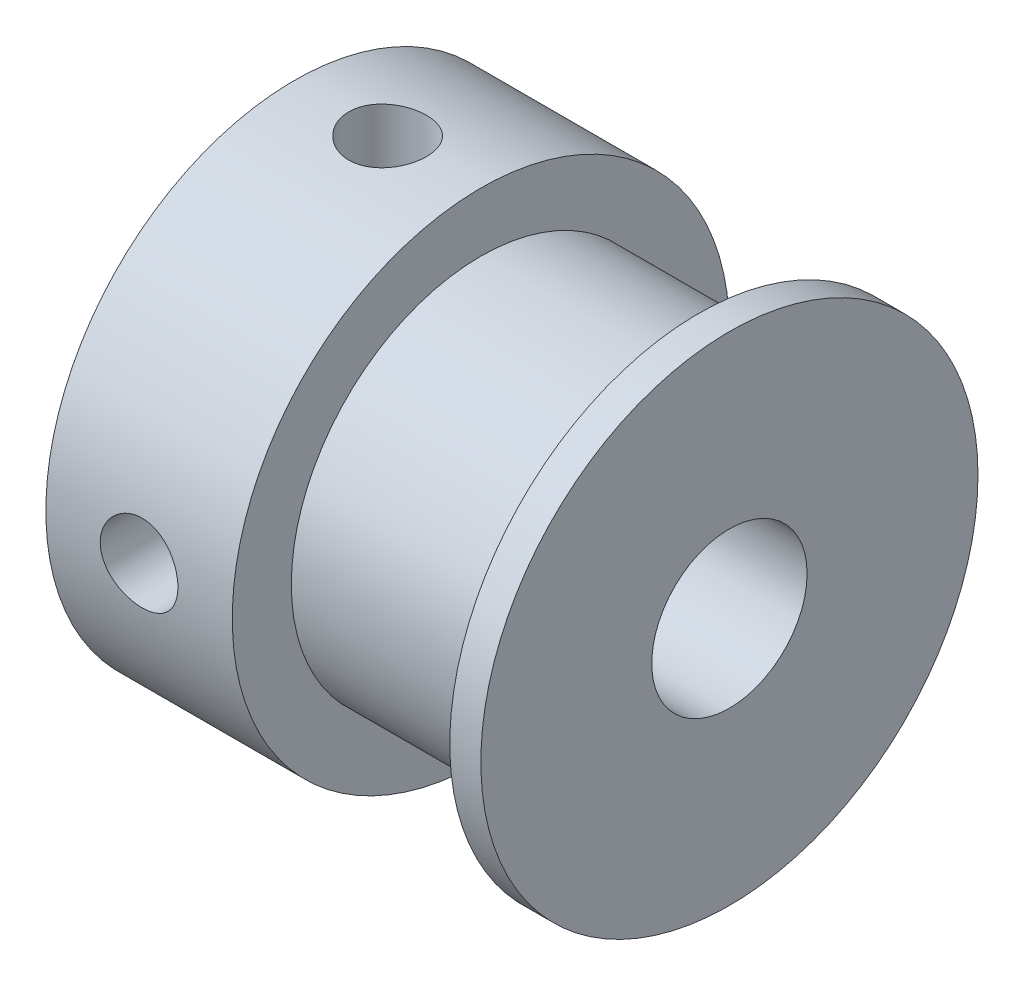
ISO-10303-21;
HEADER;
FILE_DESCRIPTION(('STEP AP214'),'2;1');
FILE_NAME('part.step','',(''),(''),'','','');
FILE_SCHEMA(('AUTOMOTIVE_DESIGN { 1 0 10303 214 1 1 1 1 }'));
ENDSEC;
DATA;
#1=APPLICATION_CONTEXT('core data for automotive mechanical design processes');
#2=APPLICATION_PROTOCOL_DEFINITION('international standard','automotive_design',2000,#1);
#3=PRODUCT_CONTEXT('',#1,'mechanical');
#4=PRODUCT('Part','Part','',(#3));
#5=PRODUCT_RELATED_PRODUCT_CATEGORY('part','',(#4));
#6=PRODUCT_DEFINITION_FORMATION('','',#4);
#7=PRODUCT_DEFINITION_CONTEXT('part definition',#1,'design');
#8=PRODUCT_DEFINITION('design','',#6,#7);
#9=PRODUCT_DEFINITION_SHAPE('','',#8);
#10=(LENGTH_UNIT() NAMED_UNIT(*) SI_UNIT(.MILLI.,.METRE.));
#11=(NAMED_UNIT(*) PLANE_ANGLE_UNIT() SI_UNIT($,.RADIAN.));
#12=(NAMED_UNIT(*) SI_UNIT($,.STERADIAN.) SOLID_ANGLE_UNIT());
#13=UNCERTAINTY_MEASURE_WITH_UNIT(LENGTH_MEASURE(1.E-05),#10,'distance_accuracy_value','');
#14=(GEOMETRIC_REPRESENTATION_CONTEXT(3) GLOBAL_UNCERTAINTY_ASSIGNED_CONTEXT((#13)) GLOBAL_UNIT_ASSIGNED_CONTEXT((#10,
#11,#12)) REPRESENTATION_CONTEXT('',''));
#15=CARTESIAN_POINT('',(0.,0.,0.));
#16=DIRECTION('',(0.,0.,1.));
#17=DIRECTION('',(1.,0.,0.));
#18=AXIS2_PLACEMENT_3D('',#15,#16,#17);
#19=CARTESIAN_POINT('',(0.,0.,0.));
#20=DIRECTION('',(1.,0.,0.));
#21=DIRECTION('',(0.,0.,-1.));
#22=AXIS2_PLACEMENT_3D('',#19,#20,#21);
#23=CYLINDRICAL_SURFACE('',#22,2.5);
#24=CARTESIAN_POINT('',(1.75000000000001,0.,2.5));
#25=CARTESIAN_POINT('',(1.75000412789938,0.0657149536912327,2.49999641755189));
#26=CARTESIAN_POINT('',(1.7552125914021,0.13150824962254,2.49738113774397));
#27=CARTESIAN_POINT('',(1.77581610042615,0.26115029408553,2.48717695046745));
#28=CARTESIAN_POINT('',(1.79123049124707,0.324995108391878,2.4795785978623));
#29=CARTESIAN_POINT('',(1.831492260771,0.448666931100716,2.4602034925414));
#30=CARTESIAN_POINT('',(1.85630298031002,0.508508503673972,2.448442989719));
#31=CARTESIAN_POINT('',(1.91446327670618,0.623090771008203,2.42182220644723));
#32=CARTESIAN_POINT('',(1.94781218031107,0.677831867487559,2.40696217041913));
#33=CARTESIAN_POINT('',(2.02439656185663,0.784384772202394,2.37445322822571));
#34=CARTESIAN_POINT('',(2.06810809904956,0.835819013902635,2.3566899890942));
#35=CARTESIAN_POINT('',(2.1631518490588,0.930974306083716,2.32074962808431));
#36=CARTESIAN_POINT('',(2.21448981471555,0.974689478883452,2.30257220261294));
#37=CARTESIAN_POINT('',(2.32810418690423,1.05656500056284,2.26623688996684));
#38=CARTESIAN_POINT('',(2.39092012293239,1.09403166943954,2.24818983712665));
#39=CARTESIAN_POINT('',(2.52295916998277,1.15771028361336,2.21607473465401));
#40=CARTESIAN_POINT('',(2.59217766090344,1.18393026870791,2.20200384508737));
#41=CARTESIAN_POINT('',(2.73083138177741,1.22266555273573,2.18072333797261));
#42=CARTESIAN_POINT('',(2.80000556508424,1.23590732135054,2.17315339479642));
#43=CARTESIAN_POINT('',(2.93997354722435,1.25053374163605,2.1647736243566));
#44=CARTESIAN_POINT('',(3.01076567608894,1.25193011046634,2.16395711679111));
#45=CARTESIAN_POINT('',(3.14285753039421,1.24335910896536,2.16888662821561));
#46=CARTESIAN_POINT('',(3.20428003902881,1.23473069942102,2.17385954577517));
#47=CARTESIAN_POINT('',(3.3246523867163,1.20867481132116,2.18845285917313));
#48=CARTESIAN_POINT('',(3.38360143163164,1.19124452987206,2.19807473539721));
#49=CARTESIAN_POINT('',(3.49903641570707,1.1477622254825,2.22109345515927));
#50=CARTESIAN_POINT('',(3.55543299848223,1.12151883389499,2.23457300829999));
#51=CARTESIAN_POINT('',(3.66329286573751,1.061302109585,2.26379255351755));
#52=CARTESIAN_POINT('',(3.71475391950011,1.02732530476558,2.27953355975239));
#53=CARTESIAN_POINT('',(3.81815156592903,0.94758256864098,2.31391447379108));
#54=CARTESIAN_POINT('',(3.86932109197019,0.900868072961596,2.33266887795933));
#55=CARTESIAN_POINT('',(3.96341927323862,0.799444473426712,2.36934529125509));
#56=CARTESIAN_POINT('',(4.00634399004235,0.744731570717852,2.38726689948501));
#57=CARTESIAN_POINT('',(4.08460707628715,0.625645632289807,2.42127484103705));
#58=CARTESIAN_POINT('',(4.11950059055717,0.560941989499257,2.43723730202509));
#59=CARTESIAN_POINT('',(4.17762128630375,0.425582769360993,2.46447351401553));
#60=CARTESIAN_POINT('',(4.20085773126895,0.354931970331593,2.47575098679441));
#61=CARTESIAN_POINT('',(4.23309425464584,0.215958114575875,2.49155417176795));
#62=CARTESIAN_POINT('',(4.24311404468347,0.147926913185404,2.4965617287664));
#63=CARTESIAN_POINT('',(4.2518309139181,0.0109744999366913,2.50091266823877));
#64=CARTESIAN_POINT('',(4.25053335704934,-0.057946274837377,2.5002587340164));
#65=CARTESIAN_POINT('',(4.23724163947655,-0.189041214982492,2.49363990316801));
#66=CARTESIAN_POINT('',(4.22608433408745,-0.251324260062442,2.48809057110237));
#67=CARTESIAN_POINT('',(4.19470241013114,-0.373008615377395,2.47277714143524));
#68=CARTESIAN_POINT('',(4.1744767919333,-0.432409607113745,2.46301257917916));
#69=CARTESIAN_POINT('',(4.12500191695853,-0.548610760562079,2.43980314267087));
#70=CARTESIAN_POINT('',(4.09551118735398,-0.605287996257689,2.42626102212424));
#71=CARTESIAN_POINT('',(4.02861558044244,-0.713076702123648,2.39679967896386));
#72=CARTESIAN_POINT('',(3.9912073317582,-0.764185787219099,2.38087944457232));
#73=CARTESIAN_POINT('',(3.9052994683339,-0.864709611613313,2.34635276671831));
#74=CARTESIAN_POINT('',(3.85607141443304,-0.913465097280795,2.32763606060552));
#75=CARTESIAN_POINT('',(3.75009356091336,-1.00232040139154,2.29077989504843));
#76=CARTESIAN_POINT('',(3.69333860147953,-1.04241423211355,2.27264084226908));
#77=CARTESIAN_POINT('',(3.57044543224961,-1.11463489312211,2.23813990282585));
#78=CARTESIAN_POINT('',(3.50398591723925,-1.14628186984829,2.2219066207934));
#79=CARTESIAN_POINT('',(3.36561241538434,-1.19760353251725,2.19467590460158));
#80=CARTESIAN_POINT('',(3.29370559187351,-1.21729364485946,2.18367172800773));
#81=CARTESIAN_POINT('',(3.15386222142319,-1.24232710931209,2.16951876260834));
#82=CARTESIAN_POINT('',(3.0862071832137,-1.24886624550107,2.16571729325614));
#83=CARTESIAN_POINT('',(2.95069116603659,-1.25086144297598,2.16456693307719));
#84=CARTESIAN_POINT('',(2.88283028907571,-1.24632230828049,2.16721524534441));
#85=CARTESIAN_POINT('',(2.75564562308498,-1.22740765699032,2.17797327562531));
#86=CARTESIAN_POINT('',(2.6961244123195,-1.21401039292849,2.18553868102992));
#87=CARTESIAN_POINT('',(2.58023985071912,-1.1789691977808,2.20463770234897));
#88=CARTESIAN_POINT('',(2.52387752238504,-1.15732261394975,2.21617259462095));
#89=CARTESIAN_POINT('',(2.41171893626674,-1.10476968162585,2.2428566295566));
#90=CARTESIAN_POINT('',(2.35621512271288,-1.07333892227057,2.25819652995239));
#91=CARTESIAN_POINT('',(2.25090682977427,-1.00268871454579,2.29044164543238));
#92=CARTESIAN_POINT('',(2.20110533685189,-0.963465214048303,2.30734767243153));
#93=CARTESIAN_POINT('',(2.10232252205298,-0.872754158330795,2.34327903949142));
#94=CARTESIAN_POINT('',(2.0541761220476,-0.820355528762707,2.36231229139336));
#95=CARTESIAN_POINT('',(1.96717127072046,-0.707693507775343,2.3984719031886));
#96=CARTESIAN_POINT('',(1.92831782571714,-0.647425904070975,2.4155972326005));
#97=CARTESIAN_POINT('',(1.86095454654725,-0.519914496024928,2.44622511981379));
#98=CARTESIAN_POINT('',(1.83251978823571,-0.452624379918263,2.45970120703636));
#99=CARTESIAN_POINT('',(1.78773979010132,-0.313427626617735,2.48126676704332));
#100=CARTESIAN_POINT('',(1.77136019146303,-0.241534749528953,2.48937154216165));
#101=CARTESIAN_POINT('',(1.7576282361552,-0.140752433104227,2.49619327387079));
#102=CARTESIAN_POINT('',(1.75477169892048,-0.112702349299371,2.49761706674002));
#103=CARTESIAN_POINT('',(1.750956668104,-0.0564396647589458,2.49952121222331));
#104=CARTESIAN_POINT('',(1.74999822691101,-0.0282270595592261,2.50000153879704));
#105=CARTESIAN_POINT('',(1.75000000000001,0.,2.5));
#106=B_SPLINE_CURVE_WITH_KNOTS('',3,(#24,#25,#26,#27,#28,#29,#30,#31,#32,#33,#34,#35,#36,#37,
#38,#39,#40,#41,#42,#43,#44,#45,#46,#47,#48,#49,#50,#51,#52,#53,#54,#55,#56,#57,#58,#59,#60,#61,
#62,#63,#64,#65,#66,#67,#68,#69,#70,#71,#72,#73,#74,#75,#76,#77,#78,#79,#80,#81,#82,#83,#84,#85,
#86,#87,#88,#89,#90,#91,#92,#93,#94,#95,#96,#97,#98,#99,#100,#101,#102,#103,#104,#105),
.UNSPECIFIED.,.T.,.F.,(4,2,2,2,2,2,2,2,2,2,2,2,2,2,2,2,2,2,2,2,2,2,2,2,2,2,2,2,2,2,2,2,2,2,2,2,
2,2,2,2,4),(0.,0.197030321775364,0.394435187136495,0.59107769436537,0.787704700726955,
0.996227198397605,1.20490779706754,1.4297715803844,1.6544743487285,1.86572515175286,
2.07676696661274,2.26257140511649,2.44843504907097,2.63862800210608,2.82890651575276,
3.04331176667346,3.25781918248356,3.48228777768049,3.70657771140347,3.9122911308918,
4.11790705639343,4.3075863313265,4.49728652038662,4.69241070034871,4.88761813435421,
5.10199513305521,5.31651985769287,5.54143352699589,5.76605639925969,5.96911634372963,
6.17208824825003,6.35572412805225,6.53941910979594,6.73545570969514,6.93159451423693,
7.15156553440619,7.37165479220712,7.59330017078652,7.81431135781158,7.89894100172117,
7.98357298143554),.UNSPECIFIED.);
#107=CARTESIAN_POINT('',(1.75000000000001,0.,2.5));
#108=VERTEX_POINT('',#107);
#109=EDGE_CURVE('E90',#108,#108,#106,.T.);
#110=ORIENTED_EDGE('',*,*,#109,.F.);
#111=EDGE_LOOP('',(#110));
#112=FACE_BOUND('',#111,.T.);
#113=CARTESIAN_POINT('',(3.,2.1650635094611,-1.25));
#114=CARTESIAN_POINT('',(3.06513476024406,2.16506918410574,-1.24999545384316));
#115=CARTESIAN_POINT('',(3.13035176440631,2.16804751484696,-1.24487496341652));
#116=CARTESIAN_POINT('',(3.25878408084644,2.17952958065066,-1.22465401237257));
#117=CARTESIAN_POINT('',(3.32199489380426,2.18804492569449,-1.20953258069272));
#118=CARTESIAN_POINT('',(3.44431458042993,2.20936683256748,-1.17012493587476));
#119=CARTESIAN_POINT('',(3.50344331559198,2.22215054341565,-1.14588744061716));
#120=CARTESIAN_POINT('',(3.6167802524959,2.25053331021072,-1.08908440672046));
#121=CARTESIAN_POINT('',(3.67098818782807,2.26613251845081,-1.05651841754472));
#122=CARTESIAN_POINT('',(3.77788216069688,2.29996086321802,-0.980833175663598));
#123=CARTESIAN_POINT('',(3.83007391959193,2.31830079547442,-0.937065045179713));
#124=CARTESIAN_POINT('',(3.92676048550839,2.35464978482132,-0.841567259518085));
#125=CARTESIAN_POINT('',(3.9712514532294,2.37265867289062,-0.789833657227866));
#126=CARTESIAN_POINT('',(4.05420893893458,2.40776846191186,-0.675611954268182));
#127=CARTESIAN_POINT('',(4.09206720982441,2.42472633022716,-0.612633986265718));
#128=CARTESIAN_POINT('',(4.1564260665572,2.45438445124411,-0.48019628324938));
#129=CARTESIAN_POINT('',(4.18293382017146,2.46708738979677,-0.410740672672694));
#130=CARTESIAN_POINT('',(4.22188082662637,2.48600576555297,-0.272556179907471));
#131=CARTESIAN_POINT('',(4.23518690794442,2.49261850276115,-0.204127238111022));
#132=CARTESIAN_POINT('',(4.2502076483438,2.50009479807584,-0.0657132858723104));
#133=CARTESIAN_POINT('',(4.25192932099464,2.50096183480737,0.00427075730467264));
#134=CARTESIAN_POINT('',(4.24406665753706,2.49703727395563,0.137290655529687));
#135=CARTESIAN_POINT('',(4.23545248059847,2.49273119865201,0.200401498970989));
#136=CARTESIAN_POINT('',(4.20889894511918,2.47967806574684,0.324142214897902));
#137=CARTESIAN_POINT('',(4.19095888877972,2.47093067582992,0.384771901367406));
#138=CARTESIAN_POINT('',(4.14614679238773,2.44964479109568,0.502886739461942));
#139=CARTESIAN_POINT('',(4.11915460853491,2.43705551911499,0.560316779393972));
#140=CARTESIAN_POINT('',(4.05717072974813,2.40922057483359,0.66997100189166));
#141=CARTESIAN_POINT('',(4.02217617087206,2.39397395196855,0.722193311048307));
#142=CARTESIAN_POINT('',(3.94138081058373,2.36055492999037,0.825217076122743));
#143=CARTESIAN_POINT('',(3.89487121459249,2.34224219997719,0.8754175937867));
#144=CARTESIAN_POINT('',(3.79426284383728,2.30567925733515,0.967630462872225));
#145=CARTESIAN_POINT('',(3.74015828465742,2.28742910332036,1.00963651446779));
#146=CARTESIAN_POINT('',(3.62168975946989,2.25180195115606,1.08688166830276));
#147=CARTESIAN_POINT('',(3.55689247118223,2.23455399988385,1.12152164372256));
#148=CARTESIAN_POINT('',(3.42132791080125,2.2046931284822,1.17914889125154));
#149=CARTESIAN_POINT('',(3.35056695872805,2.19207537557584,1.20214832276361));
#150=CARTESIAN_POINT('',(3.21098186089651,2.17430794771293,1.2339752637813));
#151=CARTESIAN_POINT('',(3.14244860119556,2.16864569810621,1.24378140264997));
#152=CARTESIAN_POINT('',(3.00449832310432,2.16397399202012,1.25189618326428));
#153=CARTESIAN_POINT('',(2.93508196360027,2.1649598361164,1.25021294664378));
#154=CARTESIAN_POINT('',(2.80543260177659,2.17292920675731,1.23629505417996));
#155=CARTESIAN_POINT('',(2.74502568611509,2.17924484383318,1.22523477089058));
#156=CARTESIAN_POINT('',(2.6270402671613,2.19617526939176,1.19462035579055));
#157=CARTESIAN_POINT('',(2.56946268656674,2.20679145006292,1.17506347327952));
#158=CARTESIAN_POINT('',(2.45573583637163,2.23170277599571,1.12705948575611));
#159=CARTESIAN_POINT('',(2.39977622893306,2.24614554053829,1.0982425796159));
#160=CARTESIAN_POINT('',(2.29316341057626,2.27695149371562,1.03285883001975));
#161=CARTESIAN_POINT('',(2.2425129456084,2.29331566693935,0.99628800541527));
#162=CARTESIAN_POINT('',(2.14127654059557,2.3285999807042,0.911046458998566));
#163=CARTESIAN_POINT('',(2.09150356160293,2.34758228942861,0.861431590393708));
#164=CARTESIAN_POINT('',(2.00073470250801,2.38417793722366,0.75425561924786));
#165=CARTESIAN_POINT('',(1.95974178721183,2.40179081259637,0.696691843319183));
#166=CARTESIAN_POINT('',(1.88678284256237,2.43426702113696,0.573169203198446));
#167=CARTESIAN_POINT('',(1.85508360223636,2.44904552090037,0.507028871967641));
#168=CARTESIAN_POINT('',(1.80357762017826,2.47354193699126,0.369402955801352));
#169=CARTESIAN_POINT('',(1.78376043579212,2.48326429595466,0.29792212674022));
#170=CARTESIAN_POINT('',(1.75828929478167,2.49584385227353,0.158724602913021));
#171=CARTESIAN_POINT('',(1.75150265515486,2.49924909885239,0.0912643048130715));
#172=CARTESIAN_POINT('',(1.748945918182,2.50052662968914,-0.0439074824390041));
#173=CARTESIAN_POINT('',(1.75317196434555,2.49840085083612,-0.111618875368858));
#174=CARTESIAN_POINT('',(1.77177050849453,2.48917461047403,-0.240672490396433));
#175=CARTESIAN_POINT('',(1.78545606157209,2.48241118334987,-0.302140397264079));
#176=CARTESIAN_POINT('',(1.82165874912871,2.46490117079279,-0.421807440229521));
#177=CARTESIAN_POINT('',(1.84417715011682,2.45415401415995,-0.480006106194385));
#178=CARTESIAN_POINT('',(1.89840881520747,2.4290741343515,-0.594279257806105));
#179=CARTESIAN_POINT('',(1.9304741540098,2.41460771498499,-0.650156428375057));
#180=CARTESIAN_POINT('',(2.00244741357381,2.38360166427283,-0.75596830226753));
#181=CARTESIAN_POINT('',(2.04235893639459,2.36706108197951,-0.805900259268633));
#182=CARTESIAN_POINT('',(2.13349642377838,2.33160762783285,-0.903642505196113));
#183=CARTESIAN_POINT('',(2.18545310934649,2.31262248764622,-0.950747105674089));
#184=CARTESIAN_POINT('',(2.29681340141221,2.27578845203566,-1.03582910924334));
#185=CARTESIAN_POINT('',(2.35622352608461,2.25794057202332,-1.07379843751257));
#186=CARTESIAN_POINT('',(2.48329580822619,2.22499506631145,-1.14053884973207));
#187=CARTESIAN_POINT('',(2.55115941391092,2.21000217820338,-1.16898133245117));
#188=CARTESIAN_POINT('',(2.69166550542472,2.1858269541044,-1.21359838688301));
#189=CARTESIAN_POINT('',(2.76429111114086,2.17662520184628,-1.22981398896918));
#190=CARTESIAN_POINT('',(2.864756694565,2.16911590752238,-1.24295875983052));
#191=CARTESIAN_POINT('',(2.89170986799735,2.1676016125644,-1.24559513120481));
#192=CARTESIAN_POINT('',(2.9457706008528,2.16557419859688,-1.24911675636245));
#193=CARTESIAN_POINT('',(2.97287817048234,2.16506114656387,-1.25000189299984));
#194=CARTESIAN_POINT('',(3.,2.1650635094611,-1.25));
#195=B_SPLINE_CURVE_WITH_KNOTS('',3,(#113,#114,#115,#116,#117,#118,#119,#120,#121,#122,#123,
#124,#125,#126,#127,#128,#129,#130,#131,#132,#133,#134,#135,#136,#137,#138,#139,#140,#141,#142,
#143,#144,#145,#146,#147,#148,#149,#150,#151,#152,#153,#154,#155,#156,#157,#158,#159,#160,#161,
#162,#163,#164,#165,#166,#167,#168,#169,#170,#171,#172,#173,#174,#175,#176,#177,#178,#179,#180,
#181,#182,#183,#184,#185,#186,#187,#188,#189,#190,#191,#192,#193,#194),.UNSPECIFIED.,.T.,.F.,(4,
2,2,2,2,2,2,2,2,2,2,2,2,2,2,2,2,2,2,2,2,2,2,2,2,2,2,2,2,2,2,2,2,2,2,2,2,2,2,2,4),(0.,
0.195290153243394,0.390991116031005,0.585660744898606,0.780340906806436,0.99107789062279,
1.20191963855464,1.42697365298454,1.65188533704864,1.86079356209919,2.0695752960755,
2.26020121855673,2.45084140646819,2.64411918413933,2.8374662418784,3.04908989321113,
3.26087560307398,3.4861105216181,3.71110967764631,3.91827863567764,4.12530116485466,
4.30967729280032,4.49411315545078,4.68709120507609,4.88016857775059,5.09758429475766,
5.31507331222752,5.53830226766207,5.76133474760964,5.96390337986858,6.16640108492464,
6.35555531089365,6.54473666890016,6.74200938399339,6.93937287625898,7.15637802312584,
7.37357428556442,7.59763436298256,7.8209391625345,7.90225168981636,7.98356965618175),.UNSPECIFIED.);
#196=CARTESIAN_POINT('',(3.,2.1650635094611,-1.25));
#197=VERTEX_POINT('',#196);
#198=EDGE_CURVE('E81',#197,#197,#195,.T.);
#199=ORIENTED_EDGE('',*,*,#198,.F.);
#200=EDGE_LOOP('',(#199));
#201=FACE_BOUND('',#200,.T.);
#202=CARTESIAN_POINT('',(14.,0.,0.));
#203=DIRECTION('',(1.,0.,0.));
#204=DIRECTION('',(0.,0.,-1.));
#205=AXIS2_PLACEMENT_3D('',#202,#203,#204);
#206=CIRCLE('',#205,2.5);
#207=CARTESIAN_POINT('',(14.,0.,-2.5));
#208=VERTEX_POINT('',#207);
#209=EDGE_CURVE('E89',#208,#208,#206,.T.);
#210=ORIENTED_EDGE('',*,*,#209,.T.);
#211=EDGE_LOOP('',(#210));
#212=FACE_BOUND('',#211,.T.);
#213=CARTESIAN_POINT('',(0.,0.,0.));
#214=DIRECTION('',(1.,0.,0.));
#215=DIRECTION('',(0.,0.,-1.));
#216=AXIS2_PLACEMENT_3D('',#213,#214,#215);
#217=CIRCLE('',#216,2.5);
#218=CARTESIAN_POINT('',(0.,0.,-2.5));
#219=VERTEX_POINT('',#218);
#220=EDGE_CURVE('E55',#219,#219,#217,.T.);
#221=ORIENTED_EDGE('',*,*,#220,.F.);
#222=EDGE_LOOP('',(#221));
#223=FACE_BOUND('',#222,.T.);
#224=ADVANCED_FACE('F37',(#112,#201,#212,#223),#23,.F.);
#225=CARTESIAN_POINT('',(0.,2.5,0.));
#226=DIRECTION('',(-1.,0.,0.));
#227=DIRECTION('',(0.,0.,1.));
#228=AXIS2_PLACEMENT_3D('',#225,#226,#227);
#229=PLANE('',#228);
#230=ORIENTED_EDGE('',*,*,#220,.T.);
#231=EDGE_LOOP('',(#230));
#232=FACE_BOUND('',#231,.T.);
#233=CARTESIAN_POINT('',(0.,0.,0.));
#234=DIRECTION('',(1.,0.,0.));
#235=DIRECTION('',(0.,0.,-1.));
#236=AXIS2_PLACEMENT_3D('',#233,#234,#235);
#237=CIRCLE('',#236,8.);
#238=CARTESIAN_POINT('',(0.,0.,-8.));
#239=VERTEX_POINT('',#238);
#240=EDGE_CURVE('E60',#239,#239,#237,.T.);
#241=ORIENTED_EDGE('',*,*,#240,.F.);
#242=EDGE_LOOP('',(#241));
#243=FACE_BOUND('',#242,.T.);
#244=ADVANCED_FACE('F122',(#232,#243),#229,.T.);
#245=CARTESIAN_POINT('',(0.,0.,0.));
#246=DIRECTION('',(1.,0.,0.));
#247=DIRECTION('',(0.,0.,-1.));
#248=AXIS2_PLACEMENT_3D('',#245,#246,#247);
#249=CYLINDRICAL_SURFACE('',#248,8.);
#250=CARTESIAN_POINT('',(1.75000000000001,0.,8.));
#251=CARTESIAN_POINT('',(1.75000284913577,-0.069757548635516,7.99999885097242));
#252=CARTESIAN_POINT('',(1.75585905688679,-0.139554702432851,7.9990780624287));
#253=CARTESIAN_POINT('',(1.77912184563838,-0.277195657489049,7.99549349048796));
#254=CARTESIAN_POINT('',(1.79653944625176,-0.345037530661656,7.99282804422361));
#255=CARTESIAN_POINT('',(1.84238983140332,-0.476756269023699,7.98605348582888));
#256=CARTESIAN_POINT('',(1.87081404068081,-0.540636176144948,7.98194549781586));
#257=CARTESIAN_POINT('',(1.93784927257081,-0.662710625522296,7.97273897019077));
#258=CARTESIAN_POINT('',(1.97645897151798,-0.72090590518415,7.96764055931276));
#259=CARTESIAN_POINT('',(2.06311652417698,-0.830459955825804,7.95697134207178));
#260=CARTESIAN_POINT('',(2.11123349744513,-0.881763739571317,7.95139725696168));
#261=CARTESIAN_POINT('',(2.21539097413445,-0.975603844114111,7.94043038065143));
#262=CARTESIAN_POINT('',(2.2714319486501,-1.01813964327095,7.93503760025374));
#263=CARTESIAN_POINT('',(2.39021913567187,-1.09345272164441,7.92501214063723));
#264=CARTESIAN_POINT('',(2.4529997411809,-1.12617636778995,7.92038369893052));
#265=CARTESIAN_POINT('',(2.58325070542891,-1.18059340798532,7.91245600871183));
#266=CARTESIAN_POINT('',(2.65072078625528,-1.20228745505031,7.90915668151108));
#267=CARTESIAN_POINT('',(2.78785545057189,-1.23385779661083,7.90429317255518));
#268=CARTESIAN_POINT('',(2.8574977929094,-1.24382852743747,7.90271513266182));
#269=CARTESIAN_POINT('',(2.99748359444632,-1.2519618487881,7.90143085535887));
#270=CARTESIAN_POINT('',(3.06782700973302,-1.25012517430232,7.90172450144012));
#271=CARTESIAN_POINT('',(3.20654851592634,-1.23477290404444,7.90413775227603));
#272=CARTESIAN_POINT('',(3.27493861167657,-1.22136281479846,7.90624086092473));
#273=CARTESIAN_POINT('',(3.40848600317966,-1.18340968916875,7.91201028172737));
#274=CARTESIAN_POINT('',(3.47364320032027,-1.15886631342065,7.91567664153206));
#275=CARTESIAN_POINT('',(3.59919435633857,-1.09923458474692,7.92417753427311));
#276=CARTESIAN_POINT('',(3.65956689588653,-1.06410186157774,7.92901696543622));
#277=CARTESIAN_POINT('',(3.77359976784276,-0.98432029073318,7.93931523075049));
#278=CARTESIAN_POINT('',(3.82725962244373,-0.939670766265077,7.94477410894106));
#279=CARTESIAN_POINT('',(3.92695512331665,-0.841545444111659,7.95576893124448));
#280=CARTESIAN_POINT('',(3.97290157913472,-0.78797900280269,7.96130506817796));
#281=CARTESIAN_POINT('',(4.05516657281994,-0.673848473689675,7.97177562673913));
#282=CARTESIAN_POINT('',(4.09148506177841,-0.613284350340655,7.97671004531012));
#283=CARTESIAN_POINT('',(4.15346903671119,-0.486797963528243,7.98542699513518));
#284=CARTESIAN_POINT('',(4.17912727926649,-0.420872093120228,7.98920874270967));
#285=CARTESIAN_POINT('',(4.21898298372361,-0.285574767348378,7.99518780000339));
#286=CARTESIAN_POINT('',(4.23318128703323,-0.216203565343599,7.99738522604488));
#287=CARTESIAN_POINT('',(4.24959463822509,-0.076754168381867,7.99993255863639));
#288=CARTESIAN_POINT('',(4.25193223948808,-0.00669073075435079,8.0003013589643));
#289=CARTESIAN_POINT('',(4.244883647332,0.13282727320582,7.99920143245634));
#290=CARTESIAN_POINT('',(4.23549784870544,0.202281859962577,7.99773276749821));
#291=CARTESIAN_POINT('',(4.2053708061599,0.33823672313285,7.99313461846611));
#292=CARTESIAN_POINT('',(4.18468962086613,0.404750631028019,7.99001392107693));
#293=CARTESIAN_POINT('',(4.1326224528006,0.53336703392831,7.98246037841779));
#294=CARTESIAN_POINT('',(4.10123593077866,0.5954693065197,7.97802746705036));
#295=CARTESIAN_POINT('',(4.02836400443671,0.7140361011252,7.96829486370472));
#296=CARTESIAN_POINT('',(3.98680128995476,0.770452561891857,7.9629886433171));
#297=CARTESIAN_POINT('',(3.8948639570461,0.875553482539025,7.95211940232218));
#298=CARTESIAN_POINT('',(3.84448878039757,0.924237452235083,7.94655636546338));
#299=CARTESIAN_POINT('',(3.73580940139139,1.01294040388345,7.93574013768325));
#300=CARTESIAN_POINT('',(3.67743757643883,1.05287699292062,7.93049020595401));
#301=CARTESIAN_POINT('',(3.55474196316933,1.1223778386332,7.92095346402914));
#302=CARTESIAN_POINT('',(3.49041834625526,1.15194239389052,7.91666662610999));
#303=CARTESIAN_POINT('',(3.3578851796429,1.19973385972497,7.90956535676178));
#304=CARTESIAN_POINT('',(3.28969126561719,1.21800327473955,7.9067454117448));
#305=CARTESIAN_POINT('',(3.15115542816801,1.24282061020267,7.90288285140397));
#306=CARTESIAN_POINT('',(3.0808136672905,1.24936941542498,7.9018401019222));
#307=CARTESIAN_POINT('',(2.94080064204626,1.25053726345377,7.90165529022442));
#308=CARTESIAN_POINT('',(2.87113045153325,1.24528590274212,7.90249258021451));
#309=CARTESIAN_POINT('',(2.73367735142786,1.2232811162795,7.90592849470915));
#310=CARTESIAN_POINT('',(2.66589443774914,1.2065277154348,7.90852711539976));
#311=CARTESIAN_POINT('',(2.53418108667974,1.16204164945925,7.91518544427453));
#312=CARTESIAN_POINT('',(2.4702472608708,1.1343188086929,7.91924384476704));
#313=CARTESIAN_POINT('',(2.34791719316187,1.06869384273208,7.92836592023698));
#314=CARTESIAN_POINT('',(2.28952117085579,1.03079131410442,7.93342963505413));
#315=CARTESIAN_POINT('',(2.17926722793659,0.945415040695392,7.9440578404613));
#316=CARTESIAN_POINT('',(2.12748390169309,0.897845535473836,7.94962700580145));
#317=CARTESIAN_POINT('',(2.03258938180664,0.794687973191015,7.96060021820367));
#318=CARTESIAN_POINT('',(1.98948020070407,0.739098060392157,7.96600422670061));
#319=CARTESIAN_POINT('',(1.91292438848422,0.621083429421703,7.9760755122835));
#320=CARTESIAN_POINT('',(1.8795373136202,0.558619686071187,7.98073817215134));
#321=CARTESIAN_POINT('',(1.82377950190353,0.428925941178889,7.9887562991944));
#322=CARTESIAN_POINT('',(1.80139751372081,0.361700888290878,7.9921131007106));
#323=CARTESIAN_POINT('',(1.77328348945471,0.245157119955795,7.9963872293244));
#324=CARTESIAN_POINT('',(1.76456575468551,0.196552787825811,7.99773495813061));
#325=CARTESIAN_POINT('',(1.75292304331047,0.0986388989252902,7.99954174348811));
#326=CARTESIAN_POINT('',(1.74999798522134,0.0493293520845589,8.00000081253982));
#327=CARTESIAN_POINT('',(1.75000000000001,0.,8.));
#328=B_SPLINE_CURVE_WITH_KNOTS('',3,(#250,#251,#252,#253,#254,#255,#256,#257,#258,#259,#260,
#261,#262,#263,#264,#265,#266,#267,#268,#269,#270,#271,#272,#273,#274,#275,#276,#277,#278,#279,
#280,#281,#282,#283,#284,#285,#286,#287,#288,#289,#290,#291,#292,#293,#294,#295,#296,#297,#298,
#299,#300,#301,#302,#303,#304,#305,#306,#307,#308,#309,#310,#311,#312,#313,#314,#315,#316,#317,
#318,#319,#320,#321,#322,#323,#324,#325,#326,#327),.UNSPECIFIED.,.T.,.F.,(4,2,2,2,2,2,2,2,2,2,2,
2,2,2,2,2,2,2,2,2,2,2,2,2,2,2,2,2,2,2,2,2,2,2,2,2,2,2,4),(0.,0.209092370238744,
0.418384321264004,0.62751353972051,0.836615593960145,1.04729784076099,1.2579926182271,
1.46981889302879,1.68163262504618,1.89172815567496,2.10181060835271,2.30999788011289,
2.51819149825524,2.72726988701172,2.93636314946032,3.14772866167182,3.35909524756912,
3.5706052187728,3.78209965914931,3.99140427002955,4.20070183264176,4.40889722378281,
4.61710310371013,4.82694270734833,5.03679560800705,5.24854740124793,5.46029309824487,
5.67123705197562,5.88216508114645,6.09078790799342,6.29941028309444,6.50784623483305,
6.7162904483567,6.92691006157766,7.13757848571146,7.34951152099917,7.56122742828136,
7.70909008175765,7.8569506552935),.UNSPECIFIED.);
#329=CARTESIAN_POINT('',(1.75000000000001,0.,8.));
#330=VERTEX_POINT('',#329);
#331=EDGE_CURVE('E10',#330,#330,#328,.T.);
#332=ORIENTED_EDGE('',*,*,#331,.F.);
#333=EDGE_LOOP('',(#332));
#334=FACE_BOUND('',#333,.T.);
#335=CARTESIAN_POINT('',(4.25,8.,0.));
#336=CARTESIAN_POINT('',(4.24999715086424,7.99999885097242,-0.0697575486355163));
#337=CARTESIAN_POINT('',(4.24414094311322,7.9990780624287,-0.139554702432852));
#338=CARTESIAN_POINT('',(4.22087815436162,7.99549349048796,-0.277195657489051));
#339=CARTESIAN_POINT('',(4.20346055374824,7.99282804422361,-0.345037530661658));
#340=CARTESIAN_POINT('',(4.15761016859669,7.98605348582888,-0.476756269023701));
#341=CARTESIAN_POINT('',(4.1291859593192,7.98194549781586,-0.540636176144951));
#342=CARTESIAN_POINT('',(4.0621507274292,7.97273897019077,-0.662710625522299));
#343=CARTESIAN_POINT('',(4.02354102848203,7.96764055931276,-0.720905905184153));
#344=CARTESIAN_POINT('',(3.93688347582302,7.95697134207178,-0.830459955825808));
#345=CARTESIAN_POINT('',(3.88876650255487,7.95139725696168,-0.881763739571321));
#346=CARTESIAN_POINT('',(3.78460902586555,7.94043038065143,-0.975603844114115));
#347=CARTESIAN_POINT('',(3.7285680513499,7.93503760025374,-1.01813964327096));
#348=CARTESIAN_POINT('',(3.60978086432814,7.92501214063723,-1.09345272164442));
#349=CARTESIAN_POINT('',(3.5470002588191,7.92038369893052,-1.12617636778996));
#350=CARTESIAN_POINT('',(3.4167492945711,7.91245600871182,-1.18059340798532));
#351=CARTESIAN_POINT('',(3.34927921374472,7.90915668151108,-1.20228745505032));
#352=CARTESIAN_POINT('',(3.21214454942811,7.90429317255518,-1.23385779661083));
#353=CARTESIAN_POINT('',(3.1425022070906,7.90271513266182,-1.24382852743748));
#354=CARTESIAN_POINT('',(3.00251640555368,7.90143085535887,-1.25196184878811));
#355=CARTESIAN_POINT('',(2.93217299026698,7.90172450144011,-1.25012517430233));
#356=CARTESIAN_POINT('',(2.79345148407366,7.90413775227603,-1.23477290404445));
#357=CARTESIAN_POINT('',(2.72506138832343,7.90624086092473,-1.22136281479846));
#358=CARTESIAN_POINT('',(2.59151399682034,7.91201028172736,-1.18340968916876));
#359=CARTESIAN_POINT('',(2.52635679967973,7.91567664153206,-1.15886631342066));
#360=CARTESIAN_POINT('',(2.40080564366142,7.92417753427311,-1.09923458474692));
#361=CARTESIAN_POINT('',(2.34043310411347,7.92901696543622,-1.06410186157774));
#362=CARTESIAN_POINT('',(2.22640023215723,7.93931523075049,-0.984320290733185));
#363=CARTESIAN_POINT('',(2.17274037755627,7.94477410894106,-0.939670766265082));
#364=CARTESIAN_POINT('',(2.07304487668334,7.95576893124448,-0.841545444111663));
#365=CARTESIAN_POINT('',(2.02709842086527,7.96130506817796,-0.787979002802695));
#366=CARTESIAN_POINT('',(1.94483342718005,7.97177562673913,-0.673848473689679));
#367=CARTESIAN_POINT('',(1.90851493822159,7.97671004531012,-0.613284350340658));
#368=CARTESIAN_POINT('',(1.8465309632888,7.98542699513518,-0.486797963528245));
#369=CARTESIAN_POINT('',(1.8208727207335,7.98920874270967,-0.42087209312023));
#370=CARTESIAN_POINT('',(1.78101701627639,7.99518780000339,-0.285574767348379));
#371=CARTESIAN_POINT('',(1.76681871296676,7.99738522604488,-0.2162035653436));
#372=CARTESIAN_POINT('',(1.75040536177491,7.99993255863639,-0.076754168381867));
#373=CARTESIAN_POINT('',(1.74806776051191,8.0003013589643,-0.00669073075435032));
#374=CARTESIAN_POINT('',(1.75511635266799,7.99920143245634,0.132827273205821));
#375=CARTESIAN_POINT('',(1.76450215129456,7.99773276749821,0.202281859962578));
#376=CARTESIAN_POINT('',(1.79462919384009,7.99313461846611,0.338236723132852));
#377=CARTESIAN_POINT('',(1.81531037913387,7.99001392107693,0.404750631028021));
#378=CARTESIAN_POINT('',(1.8673775471994,7.98246037841779,0.533367033928313));
#379=CARTESIAN_POINT('',(1.89876406922134,7.97802746705036,0.595469306519703));
#380=CARTESIAN_POINT('',(1.97163599556329,7.96829486370472,0.714036101125204));
#381=CARTESIAN_POINT('',(2.01319871004524,7.9629886433171,0.770452561891862));
#382=CARTESIAN_POINT('',(2.1051360429539,7.95211940232218,0.87555348253903));
#383=CARTESIAN_POINT('',(2.15551121960243,7.94655636546338,0.924237452235088));
#384=CARTESIAN_POINT('',(2.26419059860861,7.93574013768325,1.01294040388345));
#385=CARTESIAN_POINT('',(2.32256242356117,7.93049020595401,1.05287699292063));
#386=CARTESIAN_POINT('',(2.44525803683067,7.92095346402914,1.1223778386332));
#387=CARTESIAN_POINT('',(2.50958165374474,7.91666662610998,1.15194239389052));
#388=CARTESIAN_POINT('',(2.6421148203571,7.90956535676178,1.19973385972497));
#389=CARTESIAN_POINT('',(2.71030873438281,7.9067454117448,1.21800327473956));
#390=CARTESIAN_POINT('',(2.84884457183199,7.90288285140397,1.24282061020268));
#391=CARTESIAN_POINT('',(2.9191863327095,7.9018401019222,1.24936941542499));
#392=CARTESIAN_POINT('',(3.05919935795374,7.90165529022442,1.25053726345378));
#393=CARTESIAN_POINT('',(3.12886954846675,7.90249258021451,1.24528590274212));
#394=CARTESIAN_POINT('',(3.26632264857214,7.90592849470915,1.2232811162795));
#395=CARTESIAN_POINT('',(3.33410556225086,7.90852711539975,1.20652771543481));
#396=CARTESIAN_POINT('',(3.46581891332026,7.91518544427453,1.16204164945926));
#397=CARTESIAN_POINT('',(3.52975273912921,7.91924384476704,1.1343188086929));
#398=CARTESIAN_POINT('',(3.65208280683814,7.92836592023698,1.06869384273208));
#399=CARTESIAN_POINT('',(3.71047882914422,7.93342963505413,1.03079131410443));
#400=CARTESIAN_POINT('',(3.82073277206342,7.9440578404613,0.945415040695397));
#401=CARTESIAN_POINT('',(3.87251609830692,7.94962700580145,0.89784553547384));
#402=CARTESIAN_POINT('',(3.96741061819337,7.96060021820367,0.794687973191019));
#403=CARTESIAN_POINT('',(4.01051979929594,7.96600422670061,0.739098060392161));
#404=CARTESIAN_POINT('',(4.08707561151578,7.9760755122835,0.621083429421706));
#405=CARTESIAN_POINT('',(4.12046268637981,7.98073817215134,0.55861968607119));
#406=CARTESIAN_POINT('',(4.17622049809647,7.9887562991944,0.428925941178891));
#407=CARTESIAN_POINT('',(4.19860248627919,7.9921131007106,0.36170088829088));
#408=CARTESIAN_POINT('',(4.22671651054529,7.9963872293244,0.245157119955796));
#409=CARTESIAN_POINT('',(4.2354342453145,7.99773495813061,0.196552787825812));
#410=CARTESIAN_POINT('',(4.24707695668954,7.99954174348811,0.0986388989252907));
#411=CARTESIAN_POINT('',(4.25000201477867,8.00000081253982,0.0493293520845591));
#412=CARTESIAN_POINT('',(4.25,8.,0.));
#413=B_SPLINE_CURVE_WITH_KNOTS('',3,(#335,#336,#337,#338,#339,#340,#341,#342,#343,#344,#345,
#346,#347,#348,#349,#350,#351,#352,#353,#354,#355,#356,#357,#358,#359,#360,#361,#362,#363,#364,
#365,#366,#367,#368,#369,#370,#371,#372,#373,#374,#375,#376,#377,#378,#379,#380,#381,#382,#383,
#384,#385,#386,#387,#388,#389,#390,#391,#392,#393,#394,#395,#396,#397,#398,#399,#400,#401,#402,
#403,#404,#405,#406,#407,#408,#409,#410,#411,#412),.UNSPECIFIED.,.T.,.F.,(4,2,2,2,2,2,2,2,2,2,2,
2,2,2,2,2,2,2,2,2,2,2,2,2,2,2,2,2,2,2,2,2,2,2,2,2,2,2,4),(0.,0.209092370238745,
0.418384321264006,0.627513539720513,0.836615593960149,1.04729784076099,1.25799261822711,
1.46981889302879,1.68163262504619,1.89172815567497,2.10181060835272,2.3099978801129,
2.51819149825525,2.72726988701173,2.93636314946034,3.14772866167183,3.35909524756913,
3.57060521877282,3.78209965914933,3.99140427002957,4.20070183264178,4.40889722378283,
4.61710310371015,4.82694270734835,5.03679560800707,5.24854740124795,5.4602930982449,
5.67123705197565,5.88216508114647,6.09078790799345,6.29941028309447,6.50784623483309,
6.71629044835673,6.9269100615777,7.13757848571149,7.34951152099921,7.56122742828139,
7.70909008175769,7.85695065529354),.UNSPECIFIED.);
#414=CARTESIAN_POINT('',(4.25,8.,0.));
#415=VERTEX_POINT('',#414);
#416=EDGE_CURVE('E50',#415,#415,#413,.T.);
#417=ORIENTED_EDGE('',*,*,#416,.F.);
#418=EDGE_LOOP('',(#417));
#419=FACE_BOUND('',#418,.T.);
#420=ORIENTED_EDGE('',*,*,#240,.T.);
#421=EDGE_LOOP('',(#420));
#422=FACE_BOUND('',#421,.T.);
#423=CARTESIAN_POINT('',(6.,0.,0.));
#424=DIRECTION('',(1.,0.,0.));
#425=DIRECTION('',(0.,0.,-1.));
#426=AXIS2_PLACEMENT_3D('',#423,#424,#425);
#427=CIRCLE('',#426,8.);
#428=CARTESIAN_POINT('',(6.,0.,-8.));
#429=VERTEX_POINT('',#428);
#430=EDGE_CURVE('E113',#429,#429,#427,.T.);
#431=ORIENTED_EDGE('',*,*,#430,.F.);
#432=EDGE_LOOP('',(#431));
#433=FACE_BOUND('',#432,.T.);
#434=ADVANCED_FACE('F67',(#334,#419,#422,#433),#249,.T.);
#435=CARTESIAN_POINT('',(6.,8.,0.));
#436=DIRECTION('',(1.,0.,0.));
#437=DIRECTION('',(0.,0.,-1.));
#438=AXIS2_PLACEMENT_3D('',#435,#436,#437);
#439=PLANE('',#438);
#440=ORIENTED_EDGE('',*,*,#430,.T.);
#441=EDGE_LOOP('',(#440));
#442=FACE_BOUND('',#441,.T.);
#443=CARTESIAN_POINT('',(6.,0.,0.));
#444=DIRECTION('',(1.,0.,0.));
#445=DIRECTION('',(0.,0.,-1.));
#446=AXIS2_PLACEMENT_3D('',#443,#444,#445);
#447=CIRCLE('',#446,6.1);
#448=CARTESIAN_POINT('',(6.,0.,-6.1));
#449=VERTEX_POINT('',#448);
#450=EDGE_CURVE('E109',#449,#449,#447,.T.);
#451=ORIENTED_EDGE('',*,*,#450,.F.);
#452=EDGE_LOOP('',(#451));
#453=FACE_BOUND('',#452,.T.);
#454=ADVANCED_FACE('F129',(#442,#453),#439,.T.);
#455=CARTESIAN_POINT('',(0.,0.,0.));
#456=DIRECTION('',(1.,0.,0.));
#457=DIRECTION('',(0.,0.,-1.));
#458=AXIS2_PLACEMENT_3D('',#455,#456,#457);
#459=CYLINDRICAL_SURFACE('',#458,6.1);
#460=ORIENTED_EDGE('',*,*,#450,.T.);
#461=EDGE_LOOP('',(#460));
#462=FACE_BOUND('',#461,.T.);
#463=CARTESIAN_POINT('',(13.,0.,0.));
#464=DIRECTION('',(1.,0.,0.));
#465=DIRECTION('',(0.,0.,-1.));
#466=AXIS2_PLACEMENT_3D('',#463,#464,#465);
#467=CIRCLE('',#466,6.1);
#468=CARTESIAN_POINT('',(13.,0.,-6.1));
#469=VERTEX_POINT('',#468);
#470=EDGE_CURVE('E105',#469,#469,#467,.T.);
#471=ORIENTED_EDGE('',*,*,#470,.F.);
#472=EDGE_LOOP('',(#471));
#473=FACE_BOUND('',#472,.T.);
#474=ADVANCED_FACE('F156',(#462,#473),#459,.T.);
#475=CARTESIAN_POINT('',(13.,6.1,0.));
#476=DIRECTION('',(-1.,0.,0.));
#477=DIRECTION('',(0.,0.,1.));
#478=AXIS2_PLACEMENT_3D('',#475,#476,#477);
#479=PLANE('',#478);
#480=ORIENTED_EDGE('',*,*,#470,.T.);
#481=EDGE_LOOP('',(#480));
#482=FACE_BOUND('',#481,.T.);
#483=CARTESIAN_POINT('',(13.,0.,0.));
#484=DIRECTION('',(1.,0.,0.));
#485=DIRECTION('',(0.,0.,-1.));
#486=AXIS2_PLACEMENT_3D('',#483,#484,#485);
#487=CIRCLE('',#486,8.);
#488=CARTESIAN_POINT('',(13.,0.,-8.));
#489=VERTEX_POINT('',#488);
#490=EDGE_CURVE('E101',#489,#489,#487,.T.);
#491=ORIENTED_EDGE('',*,*,#490,.F.);
#492=EDGE_LOOP('',(#491));
#493=FACE_BOUND('',#492,.T.);
#494=ADVANCED_FACE('F149',(#482,#493),#479,.T.);
#495=CARTESIAN_POINT('',(0.,0.,0.));
#496=DIRECTION('',(1.,0.,0.));
#497=DIRECTION('',(0.,0.,-1.));
#498=AXIS2_PLACEMENT_3D('',#495,#496,#497);
#499=CYLINDRICAL_SURFACE('',#498,8.);
#500=ORIENTED_EDGE('',*,*,#490,.T.);
#501=EDGE_LOOP('',(#500));
#502=FACE_BOUND('',#501,.T.);
#503=CARTESIAN_POINT('',(14.,0.,0.));
#504=DIRECTION('',(1.,0.,0.));
#505=DIRECTION('',(0.,0.,-1.));
#506=AXIS2_PLACEMENT_3D('',#503,#504,#505);
#507=CIRCLE('',#506,8.);
#508=CARTESIAN_POINT('',(14.,0.,-8.));
#509=VERTEX_POINT('',#508);
#510=EDGE_CURVE('E97',#509,#509,#507,.T.);
#511=ORIENTED_EDGE('',*,*,#510,.F.);
#512=EDGE_LOOP('',(#511));
#513=FACE_BOUND('',#512,.T.);
#514=ADVANCED_FACE('F144',(#502,#513),#499,.T.);
#515=CARTESIAN_POINT('',(14.,8.,0.));
#516=DIRECTION('',(1.,0.,0.));
#517=DIRECTION('',(0.,0.,-1.));
#518=AXIS2_PLACEMENT_3D('',#515,#516,#517);
#519=PLANE('',#518);
#520=ORIENTED_EDGE('',*,*,#510,.T.);
#521=EDGE_LOOP('',(#520));
#522=FACE_BOUND('',#521,.T.);
#523=ORIENTED_EDGE('',*,*,#209,.F.);
#524=EDGE_LOOP('',(#523));
#525=FACE_BOUND('',#524,.T.);
#526=ADVANCED_FACE('F75',(#522,#525),#519,.T.);
#527=CARTESIAN_POINT('',(3.,0.,0.));
#528=DIRECTION('',(0.,-1.,0.));
#529=DIRECTION('',(0.,0.,-1.));
#530=AXIS2_PLACEMENT_3D('',#527,#528,#529);
#531=CYLINDRICAL_SURFACE('',#530,1.25);
#532=ORIENTED_EDGE('',*,*,#198,.T.);
#533=EDGE_LOOP('',(#532));
#534=FACE_BOUND('',#533,.T.);
#535=ORIENTED_EDGE('',*,*,#416,.T.);
#536=EDGE_LOOP('',(#535));
#537=FACE_BOUND('',#536,.T.);
#538=ADVANCED_FACE('F70',(#534,#537),#531,.F.);
#539=CARTESIAN_POINT('',(3.,0.,0.));
#540=DIRECTION('',(0.,0.,-1.));
#541=DIRECTION('',(-1.,0.,0.));
#542=AXIS2_PLACEMENT_3D('',#539,#540,#541);
#543=CYLINDRICAL_SURFACE('',#542,1.24999999999999);
#544=ORIENTED_EDGE('',*,*,#109,.T.);
#545=EDGE_LOOP('',(#544));
#546=FACE_BOUND('',#545,.T.);
#547=ORIENTED_EDGE('',*,*,#331,.T.);
#548=EDGE_LOOP('',(#547));
#549=FACE_BOUND('',#548,.T.);
#550=ADVANCED_FACE('F74',(#546,#549),#543,.F.);
#551=CLOSED_SHELL('',(#224,#244,#434,#454,#474,#494,#514,#526,#538,#550));
#552=MANIFOLD_SOLID_BREP('B2',#551);
#553=ADVANCED_BREP_SHAPE_REPRESENTATION('',(#18,#552),#14);
#554=SHAPE_DEFINITION_REPRESENTATION(#9,#553);
ENDSEC;
END-ISO-10303-21;
